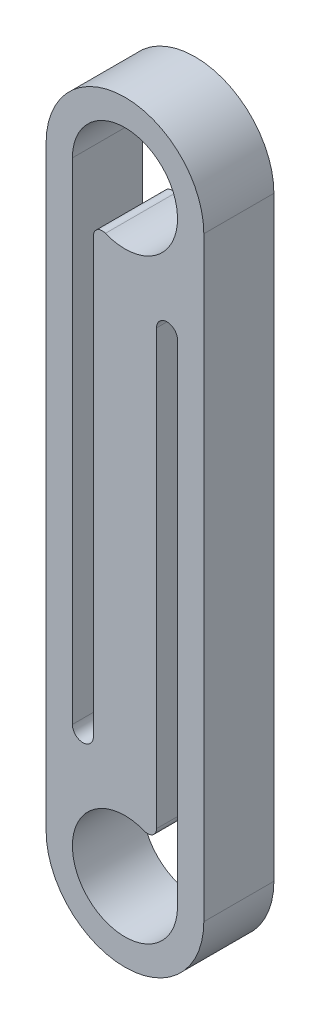
ISO-10303-21;
HEADER;
FILE_DESCRIPTION(('STEP AP214'),'2;1');
FILE_NAME('part.step','',(''),(''),'','','');
FILE_SCHEMA(('AUTOMOTIVE_DESIGN { 1 0 10303 214 1 1 1 1 }'));
ENDSEC;
DATA;
#1=APPLICATION_CONTEXT('core data for automotive mechanical design processes');
#2=APPLICATION_PROTOCOL_DEFINITION('international standard','automotive_design',2000,#1);
#3=PRODUCT_CONTEXT('',#1,'mechanical');
#4=PRODUCT('Part','Part','',(#3));
#5=PRODUCT_RELATED_PRODUCT_CATEGORY('part','',(#4));
#6=PRODUCT_DEFINITION_FORMATION('','',#4);
#7=PRODUCT_DEFINITION_CONTEXT('part definition',#1,'design');
#8=PRODUCT_DEFINITION('design','',#6,#7);
#9=PRODUCT_DEFINITION_SHAPE('','',#8);
#10=(LENGTH_UNIT() NAMED_UNIT(*) SI_UNIT(.MILLI.,.METRE.));
#11=(NAMED_UNIT(*) PLANE_ANGLE_UNIT() SI_UNIT($,.RADIAN.));
#12=(NAMED_UNIT(*) SI_UNIT($,.STERADIAN.) SOLID_ANGLE_UNIT());
#13=UNCERTAINTY_MEASURE_WITH_UNIT(LENGTH_MEASURE(1.E-05),#10,'distance_accuracy_value','');
#14=(GEOMETRIC_REPRESENTATION_CONTEXT(3) GLOBAL_UNCERTAINTY_ASSIGNED_CONTEXT((#13)) GLOBAL_UNIT_ASSIGNED_CONTEXT((#10,
#11,#12)) REPRESENTATION_CONTEXT('',''));
#15=CARTESIAN_POINT('',(0.,0.,0.));
#16=DIRECTION('',(0.,0.,1.));
#17=DIRECTION('',(1.,0.,0.));
#18=AXIS2_PLACEMENT_3D('',#15,#16,#17);
#19=CARTESIAN_POINT('',(0.,34.,4.));
#20=DIRECTION('',(0.,0.,1.));
#21=DIRECTION('',(1.,0.,0.));
#22=AXIS2_PLACEMENT_3D('',#19,#20,#21);
#23=PLANE('',#22);
#24=CARTESIAN_POINT('',(0.,34.,4.));
#25=DIRECTION('',(0.,0.,1.));
#26=DIRECTION('',(1.,0.,0.));
#27=AXIS2_PLACEMENT_3D('',#24,#25,#26);
#28=CIRCLE('',#27,4.5);
#29=CARTESIAN_POINT('',(4.49999999999999,34.,4.));
#30=VERTEX_POINT('',#29);
#31=CARTESIAN_POINT('',(-4.5,34.,4.));
#32=VERTEX_POINT('',#31);
#33=EDGE_CURVE('E218',#30,#32,#28,.T.);
#34=ORIENTED_EDGE('',*,*,#33,.T.);
#35=DIRECTION('',(0.,-1.,0.));
#36=VECTOR('',#35,1.);
#37=CARTESIAN_POINT('',(-4.5,34.,4.));
#38=LINE('',#37,#36);
#39=CARTESIAN_POINT('',(-4.5,0.,4.));
#40=VERTEX_POINT('',#39);
#41=EDGE_CURVE('E221',#32,#40,#38,.T.);
#42=ORIENTED_EDGE('',*,*,#41,.T.);
#43=CARTESIAN_POINT('',(0.,0.,4.));
#44=DIRECTION('',(0.,0.,1.));
#45=DIRECTION('',(1.,0.,0.));
#46=AXIS2_PLACEMENT_3D('',#43,#44,#45);
#47=CIRCLE('',#46,4.5);
#48=CARTESIAN_POINT('',(4.5,0.,4.));
#49=VERTEX_POINT('',#48);
#50=EDGE_CURVE('E224',#40,#49,#47,.T.);
#51=ORIENTED_EDGE('',*,*,#50,.T.);
#52=DIRECTION('',(0.,1.,0.));
#53=VECTOR('',#52,1.);
#54=CARTESIAN_POINT('',(4.49999999999999,34.,4.));
#55=LINE('',#54,#53);
#56=EDGE_CURVE('E226',#49,#30,#55,.T.);
#57=ORIENTED_EDGE('',*,*,#56,.T.);
#58=EDGE_LOOP('',(#34,#42,#51,#57));
#59=FACE_BOUND('',#58,.T.);
#60=DIRECTION('',(0.,-1.,0.));
#61=VECTOR('',#60,1.);
#62=CARTESIAN_POINT('',(-3.00000000000001,34.,4.));
#63=LINE('',#62,#61);
#64=CARTESIAN_POINT('',(-3.00000000000001,34.,4.));
#65=VERTEX_POINT('',#64);
#66=CARTESIAN_POINT('',(-3.00000000000001,6.,4.));
#67=VERTEX_POINT('',#66);
#68=EDGE_CURVE('E182',#65,#67,#63,.T.);
#69=ORIENTED_EDGE('',*,*,#68,.F.);
#70=CARTESIAN_POINT('',(0.,34.,4.));
#71=DIRECTION('',(0.,0.,1.));
#72=DIRECTION('',(1.,0.,0.));
#73=AXIS2_PLACEMENT_3D('',#70,#71,#72);
#74=CIRCLE('',#73,3.);
#75=CARTESIAN_POINT('',(-1.11428571428572,31.2146154041248,4.));
#76=VERTEX_POINT('',#75);
#77=EDGE_CURVE('E180',#76,#65,#74,.T.);
#78=ORIENTED_EDGE('',*,*,#77,.F.);
#79=CARTESIAN_POINT('',(-1.30000000000001,30.7503846381456,4.));
#80=DIRECTION('',(0.,0.,-1.));
#81=DIRECTION('',(-1.,0.,0.));
#82=AXIS2_PLACEMENT_3D('',#79,#80,#81);
#83=CIRCLE('',#82,0.500000000000001);
#84=CARTESIAN_POINT('',(-1.80000000000001,30.7503846381456,4.));
#85=VERTEX_POINT('',#84);
#86=EDGE_CURVE('E190',#85,#76,#83,.T.);
#87=ORIENTED_EDGE('',*,*,#86,.F.);
#88=DIRECTION('',(0.,1.,0.));
#89=VECTOR('',#88,1.);
#90=CARTESIAN_POINT('',(-1.80000000000001,6.,4.));
#91=LINE('',#90,#89);
#92=CARTESIAN_POINT('',(-1.80000000000001,6.,4.));
#93=VERTEX_POINT('',#92);
#94=EDGE_CURVE('E187',#93,#85,#91,.T.);
#95=ORIENTED_EDGE('',*,*,#94,.F.);
#96=CARTESIAN_POINT('',(-2.40000000000001,6.,4.));
#97=DIRECTION('',(0.,0.,1.));
#98=DIRECTION('',(1.,0.,0.));
#99=AXIS2_PLACEMENT_3D('',#96,#97,#98);
#100=CIRCLE('',#99,0.6);
#101=EDGE_CURVE('E185',#67,#93,#100,.T.);
#102=ORIENTED_EDGE('',*,*,#101,.F.);
#103=EDGE_LOOP('',(#69,#78,#87,#95,#102));
#104=FACE_BOUND('',#103,.T.);
#105=DIRECTION('',(0.,1.,0.));
#106=VECTOR('',#105,1.);
#107=CARTESIAN_POINT('',(3.,0.,4.));
#108=LINE('',#107,#106);
#109=CARTESIAN_POINT('',(3.,0.,4.));
#110=VERTEX_POINT('',#109);
#111=CARTESIAN_POINT('',(3.,28.,4.));
#112=VERTEX_POINT('',#111);
#113=EDGE_CURVE('E144',#110,#112,#108,.T.);
#114=ORIENTED_EDGE('',*,*,#113,.F.);
#115=CARTESIAN_POINT('',(0.,0.,4.));
#116=DIRECTION('',(0.,0.,1.));
#117=DIRECTION('',(1.,0.,0.));
#118=AXIS2_PLACEMENT_3D('',#115,#116,#117);
#119=CIRCLE('',#118,3.);
#120=CARTESIAN_POINT('',(1.11428571428571,2.78538459587519,4.));
#121=VERTEX_POINT('',#120);
#122=EDGE_CURVE('E136',#121,#110,#119,.T.);
#123=ORIENTED_EDGE('',*,*,#122,.F.);
#124=CARTESIAN_POINT('',(1.3,3.24961536185438,4.));
#125=DIRECTION('',(0.,0.,-1.));
#126=DIRECTION('',(-1.,0.,0.));
#127=AXIS2_PLACEMENT_3D('',#124,#125,#126);
#128=CIRCLE('',#127,0.5);
#129=CARTESIAN_POINT('',(1.8,3.24961536185438,4.));
#130=VERTEX_POINT('',#129);
#131=EDGE_CURVE('E163',#130,#121,#128,.T.);
#132=ORIENTED_EDGE('',*,*,#131,.F.);
#133=DIRECTION('',(0.,-1.,0.));
#134=VECTOR('',#133,1.);
#135=CARTESIAN_POINT('',(1.8,28.,4.));
#136=LINE('',#135,#134);
#137=CARTESIAN_POINT('',(1.8,28.,4.));
#138=VERTEX_POINT('',#137);
#139=EDGE_CURVE('E159',#138,#130,#136,.T.);
#140=ORIENTED_EDGE('',*,*,#139,.F.);
#141=CARTESIAN_POINT('',(2.4,28.,4.));
#142=DIRECTION('',(0.,0.,1.));
#143=DIRECTION('',(1.,0.,0.));
#144=AXIS2_PLACEMENT_3D('',#141,#142,#143);
#145=CIRCLE('',#144,0.6);
#146=EDGE_CURVE('E157',#112,#138,#145,.T.);
#147=ORIENTED_EDGE('',*,*,#146,.F.);
#148=EDGE_LOOP('',(#114,#123,#132,#140,#147));
#149=FACE_BOUND('',#148,.T.);
#150=ADVANCED_FACE('F35',(#59,#104,#149),#23,.T.);
#151=CARTESIAN_POINT('',(0.,34.,0.));
#152=DIRECTION('',(0.,0.,1.));
#153=DIRECTION('',(1.,0.,0.));
#154=AXIS2_PLACEMENT_3D('',#151,#152,#153);
#155=PLANE('',#154);
#156=CARTESIAN_POINT('',(0.,34.,0.));
#157=DIRECTION('',(0.,0.,1.));
#158=DIRECTION('',(1.,0.,0.));
#159=AXIS2_PLACEMENT_3D('',#156,#157,#158);
#160=CIRCLE('',#159,3.);
#161=CARTESIAN_POINT('',(-1.11428571428572,31.2146154041248,0.));
#162=VERTEX_POINT('',#161);
#163=CARTESIAN_POINT('',(-3.00000000000001,34.,0.));
#164=VERTEX_POINT('',#163);
#165=EDGE_CURVE('E152',#162,#164,#160,.T.);
#166=ORIENTED_EDGE('',*,*,#165,.T.);
#167=DIRECTION('',(0.,-1.,0.));
#168=VECTOR('',#167,1.);
#169=CARTESIAN_POINT('',(-3.00000000000001,34.,0.));
#170=LINE('',#169,#168);
#171=CARTESIAN_POINT('',(-3.00000000000001,6.,0.));
#172=VERTEX_POINT('',#171);
#173=EDGE_CURVE('E195',#164,#172,#170,.T.);
#174=ORIENTED_EDGE('',*,*,#173,.T.);
#175=CARTESIAN_POINT('',(-2.40000000000001,6.,0.));
#176=DIRECTION('',(0.,0.,1.));
#177=DIRECTION('',(1.,0.,0.));
#178=AXIS2_PLACEMENT_3D('',#175,#176,#177);
#179=CIRCLE('',#178,0.6);
#180=CARTESIAN_POINT('',(-1.80000000000001,6.,0.));
#181=VERTEX_POINT('',#180);
#182=EDGE_CURVE('E198',#172,#181,#179,.T.);
#183=ORIENTED_EDGE('',*,*,#182,.T.);
#184=DIRECTION('',(0.,1.,0.));
#185=VECTOR('',#184,1.);
#186=CARTESIAN_POINT('',(-1.80000000000001,6.,0.));
#187=LINE('',#186,#185);
#188=CARTESIAN_POINT('',(-1.80000000000001,30.7503846381456,0.));
#189=VERTEX_POINT('',#188);
#190=EDGE_CURVE('E201',#181,#189,#187,.T.);
#191=ORIENTED_EDGE('',*,*,#190,.T.);
#192=CARTESIAN_POINT('',(-1.30000000000001,30.7503846381456,0.));
#193=DIRECTION('',(0.,0.,-1.));
#194=DIRECTION('',(-1.,0.,0.));
#195=AXIS2_PLACEMENT_3D('',#192,#193,#194);
#196=CIRCLE('',#195,0.500000000000001);
#197=EDGE_CURVE('E183',#189,#162,#196,.T.);
#198=ORIENTED_EDGE('',*,*,#197,.T.);
#199=EDGE_LOOP('',(#166,#174,#183,#191,#198));
#200=FACE_BOUND('',#199,.T.);
#201=CARTESIAN_POINT('',(0.,34.,0.));
#202=DIRECTION('',(0.,0.,1.));
#203=DIRECTION('',(1.,0.,0.));
#204=AXIS2_PLACEMENT_3D('',#201,#202,#203);
#205=CIRCLE('',#204,4.5);
#206=CARTESIAN_POINT('',(4.49999999999999,34.,0.));
#207=VERTEX_POINT('',#206);
#208=CARTESIAN_POINT('',(-4.5,34.,0.));
#209=VERTEX_POINT('',#208);
#210=EDGE_CURVE('E217',#207,#209,#205,.T.);
#211=ORIENTED_EDGE('',*,*,#210,.F.);
#212=DIRECTION('',(0.,1.,0.));
#213=VECTOR('',#212,1.);
#214=CARTESIAN_POINT('',(4.49999999999999,34.,0.));
#215=LINE('',#214,#213);
#216=CARTESIAN_POINT('',(4.5,0.,0.));
#217=VERTEX_POINT('',#216);
#218=EDGE_CURVE('E222',#217,#207,#215,.T.);
#219=ORIENTED_EDGE('',*,*,#218,.F.);
#220=CARTESIAN_POINT('',(0.,0.,0.));
#221=DIRECTION('',(0.,0.,1.));
#222=DIRECTION('',(1.,0.,0.));
#223=AXIS2_PLACEMENT_3D('',#220,#221,#222);
#224=CIRCLE('',#223,4.5);
#225=CARTESIAN_POINT('',(-4.5,0.,0.));
#226=VERTEX_POINT('',#225);
#227=EDGE_CURVE('E233',#226,#217,#224,.T.);
#228=ORIENTED_EDGE('',*,*,#227,.F.);
#229=DIRECTION('',(0.,-1.,0.));
#230=VECTOR('',#229,1.);
#231=CARTESIAN_POINT('',(-4.5,34.,0.));
#232=LINE('',#231,#230);
#233=EDGE_CURVE('E231',#209,#226,#232,.T.);
#234=ORIENTED_EDGE('',*,*,#233,.F.);
#235=EDGE_LOOP('',(#211,#219,#228,#234));
#236=FACE_BOUND('',#235,.T.);
#237=CARTESIAN_POINT('',(0.,0.,0.));
#238=DIRECTION('',(0.,0.,1.));
#239=DIRECTION('',(1.,0.,0.));
#240=AXIS2_PLACEMENT_3D('',#237,#238,#239);
#241=CIRCLE('',#240,3.);
#242=CARTESIAN_POINT('',(1.11428571428571,2.78538459587519,0.));
#243=VERTEX_POINT('',#242);
#244=CARTESIAN_POINT('',(3.,0.,0.));
#245=VERTEX_POINT('',#244);
#246=EDGE_CURVE('E58',#243,#245,#241,.T.);
#247=ORIENTED_EDGE('',*,*,#246,.T.);
#248=DIRECTION('',(0.,1.,0.));
#249=VECTOR('',#248,1.);
#250=CARTESIAN_POINT('',(3.,0.,0.));
#251=LINE('',#250,#249);
#252=CARTESIAN_POINT('',(3.,28.,0.));
#253=VERTEX_POINT('',#252);
#254=EDGE_CURVE('E151',#245,#253,#251,.T.);
#255=ORIENTED_EDGE('',*,*,#254,.T.);
#256=CARTESIAN_POINT('',(2.4,28.,0.));
#257=DIRECTION('',(0.,0.,1.));
#258=DIRECTION('',(1.,0.,0.));
#259=AXIS2_PLACEMENT_3D('',#256,#257,#258);
#260=CIRCLE('',#259,0.6);
#261=CARTESIAN_POINT('',(1.8,28.,0.));
#262=VERTEX_POINT('',#261);
#263=EDGE_CURVE('E167',#253,#262,#260,.T.);
#264=ORIENTED_EDGE('',*,*,#263,.T.);
#265=DIRECTION('',(0.,-1.,0.));
#266=VECTOR('',#265,1.);
#267=CARTESIAN_POINT('',(1.8,28.,0.));
#268=LINE('',#267,#266);
#269=CARTESIAN_POINT('',(1.8,3.24961536185438,0.));
#270=VERTEX_POINT('',#269);
#271=EDGE_CURVE('E170',#262,#270,#268,.T.);
#272=ORIENTED_EDGE('',*,*,#271,.T.);
#273=CARTESIAN_POINT('',(1.3,3.24961536185438,0.));
#274=DIRECTION('',(0.,0.,-1.));
#275=DIRECTION('',(-1.,0.,0.));
#276=AXIS2_PLACEMENT_3D('',#273,#274,#275);
#277=CIRCLE('',#276,0.5);
#278=EDGE_CURVE('E145',#270,#243,#277,.T.);
#279=ORIENTED_EDGE('',*,*,#278,.T.);
#280=EDGE_LOOP('',(#247,#255,#264,#272,#279));
#281=FACE_BOUND('',#280,.T.);
#282=ADVANCED_FACE('F251',(#200,#236,#281),#155,.F.);
#283=CARTESIAN_POINT('',(0.,34.,4.));
#284=DIRECTION('',(0.,0.,-1.));
#285=DIRECTION('',(-1.,0.,0.));
#286=AXIS2_PLACEMENT_3D('',#283,#284,#285);
#287=CYLINDRICAL_SURFACE('',#286,4.5);
#288=ORIENTED_EDGE('',*,*,#210,.T.);
#289=DIRECTION('',(0.,0.,-1.));
#290=VECTOR('',#289,1.);
#291=CARTESIAN_POINT('',(-4.5,34.,4.));
#292=LINE('',#291,#290);
#293=EDGE_CURVE('E11',#32,#209,#292,.T.);
#294=ORIENTED_EDGE('',*,*,#293,.F.);
#295=ORIENTED_EDGE('',*,*,#33,.F.);
#296=DIRECTION('',(0.,0.,-1.));
#297=VECTOR('',#296,1.);
#298=CARTESIAN_POINT('',(4.49999999999999,34.,4.));
#299=LINE('',#298,#297);
#300=EDGE_CURVE('E228',#30,#207,#299,.T.);
#301=ORIENTED_EDGE('',*,*,#300,.T.);
#302=EDGE_LOOP('',(#288,#294,#295,#301));
#303=FACE_BOUND('',#302,.T.);
#304=ADVANCED_FACE('F37',(#303),#287,.T.);
#305=CARTESIAN_POINT('',(-4.5,34.,4.));
#306=DIRECTION('',(1.,0.,0.));
#307=DIRECTION('',(0.,1.,0.));
#308=AXIS2_PLACEMENT_3D('',#305,#306,#307);
#309=PLANE('',#308);
#310=ORIENTED_EDGE('',*,*,#233,.T.);
#311=DIRECTION('',(0.,0.,-1.));
#312=VECTOR('',#311,1.);
#313=CARTESIAN_POINT('',(-4.5,0.,4.));
#314=LINE('',#313,#312);
#315=EDGE_CURVE('E43',#40,#226,#314,.T.);
#316=ORIENTED_EDGE('',*,*,#315,.F.);
#317=ORIENTED_EDGE('',*,*,#41,.F.);
#318=ORIENTED_EDGE('',*,*,#293,.T.);
#319=EDGE_LOOP('',(#310,#316,#317,#318));
#320=FACE_BOUND('',#319,.T.);
#321=ADVANCED_FACE('F262',(#320),#309,.F.);
#322=CARTESIAN_POINT('',(0.,0.,4.));
#323=DIRECTION('',(0.,0.,-1.));
#324=DIRECTION('',(-1.,0.,0.));
#325=AXIS2_PLACEMENT_3D('',#322,#323,#324);
#326=CYLINDRICAL_SURFACE('',#325,4.5);
#327=ORIENTED_EDGE('',*,*,#227,.T.);
#328=DIRECTION('',(0.,0.,-1.));
#329=VECTOR('',#328,1.);
#330=CARTESIAN_POINT('',(4.5,0.,4.));
#331=LINE('',#330,#329);
#332=EDGE_CURVE('E238',#49,#217,#331,.T.);
#333=ORIENTED_EDGE('',*,*,#332,.F.);
#334=ORIENTED_EDGE('',*,*,#50,.F.);
#335=ORIENTED_EDGE('',*,*,#315,.T.);
#336=EDGE_LOOP('',(#327,#333,#334,#335));
#337=FACE_BOUND('',#336,.T.);
#338=ADVANCED_FACE('F245',(#337),#326,.T.);
#339=CARTESIAN_POINT('',(4.49999999999999,34.,4.));
#340=DIRECTION('',(-1.,0.,0.));
#341=DIRECTION('',(0.,-1.,0.));
#342=AXIS2_PLACEMENT_3D('',#339,#340,#341);
#343=PLANE('',#342);
#344=ORIENTED_EDGE('',*,*,#218,.T.);
#345=ORIENTED_EDGE('',*,*,#300,.F.);
#346=ORIENTED_EDGE('',*,*,#56,.F.);
#347=ORIENTED_EDGE('',*,*,#332,.T.);
#348=EDGE_LOOP('',(#344,#345,#346,#347));
#349=FACE_BOUND('',#348,.T.);
#350=ADVANCED_FACE('F255',(#349),#343,.F.);
#351=CARTESIAN_POINT('',(0.,34.,4.));
#352=DIRECTION('',(0.,0.,-1.));
#353=DIRECTION('',(-1.,0.,0.));
#354=AXIS2_PLACEMENT_3D('',#351,#352,#353);
#355=CYLINDRICAL_SURFACE('',#354,3.);
#356=ORIENTED_EDGE('',*,*,#165,.F.);
#357=DIRECTION('',(0.,0.,-1.));
#358=VECTOR('',#357,1.);
#359=CARTESIAN_POINT('',(-1.11428571428572,31.2146154041248,4.));
#360=LINE('',#359,#358);
#361=EDGE_CURVE('E192',#76,#162,#360,.T.);
#362=ORIENTED_EDGE('',*,*,#361,.F.);
#363=ORIENTED_EDGE('',*,*,#77,.T.);
#364=DIRECTION('',(0.,0.,-1.));
#365=VECTOR('',#364,1.);
#366=CARTESIAN_POINT('',(-3.00000000000001,34.,4.));
#367=LINE('',#366,#365);
#368=EDGE_CURVE('E214',#65,#164,#367,.T.);
#369=ORIENTED_EDGE('',*,*,#368,.T.);
#370=EDGE_LOOP('',(#356,#362,#363,#369));
#371=FACE_BOUND('',#370,.T.);
#372=ADVANCED_FACE('F277',(#371),#355,.F.);
#373=CARTESIAN_POINT('',(-3.00000000000001,34.,4.));
#374=DIRECTION('',(1.,0.,0.));
#375=DIRECTION('',(0.,0.,-1.));
#376=AXIS2_PLACEMENT_3D('',#373,#374,#375);
#377=PLANE('',#376);
#378=ORIENTED_EDGE('',*,*,#173,.F.);
#379=ORIENTED_EDGE('',*,*,#368,.F.);
#380=ORIENTED_EDGE('',*,*,#68,.T.);
#381=DIRECTION('',(0.,0.,-1.));
#382=VECTOR('',#381,1.);
#383=CARTESIAN_POINT('',(-3.00000000000001,6.,4.));
#384=LINE('',#383,#382);
#385=EDGE_CURVE('E212',#67,#172,#384,.T.);
#386=ORIENTED_EDGE('',*,*,#385,.T.);
#387=EDGE_LOOP('',(#378,#379,#380,#386));
#388=FACE_BOUND('',#387,.T.);
#389=ADVANCED_FACE('F284',(#388),#377,.T.);
#390=CARTESIAN_POINT('',(-2.40000000000001,6.,4.));
#391=DIRECTION('',(0.,0.,-1.));
#392=DIRECTION('',(-1.,0.,0.));
#393=AXIS2_PLACEMENT_3D('',#390,#391,#392);
#394=CYLINDRICAL_SURFACE('',#393,0.6);
#395=ORIENTED_EDGE('',*,*,#182,.F.);
#396=ORIENTED_EDGE('',*,*,#385,.F.);
#397=ORIENTED_EDGE('',*,*,#101,.T.);
#398=DIRECTION('',(0.,0.,-1.));
#399=VECTOR('',#398,1.);
#400=CARTESIAN_POINT('',(-1.80000000000001,6.,4.));
#401=LINE('',#400,#399);
#402=EDGE_CURVE('E210',#93,#181,#401,.T.);
#403=ORIENTED_EDGE('',*,*,#402,.T.);
#404=EDGE_LOOP('',(#395,#396,#397,#403));
#405=FACE_BOUND('',#404,.T.);
#406=ADVANCED_FACE('F289',(#405),#394,.F.);
#407=CARTESIAN_POINT('',(-1.80000000000001,6.,4.));
#408=DIRECTION('',(-1.,0.,0.));
#409=DIRECTION('',(0.,0.,1.));
#410=AXIS2_PLACEMENT_3D('',#407,#408,#409);
#411=PLANE('',#410);
#412=ORIENTED_EDGE('',*,*,#190,.F.);
#413=ORIENTED_EDGE('',*,*,#402,.F.);
#414=ORIENTED_EDGE('',*,*,#94,.T.);
#415=DIRECTION('',(0.,0.,-1.));
#416=VECTOR('',#415,1.);
#417=CARTESIAN_POINT('',(-1.80000000000001,30.7503846381456,4.));
#418=LINE('',#417,#416);
#419=EDGE_CURVE('E208',#85,#189,#418,.T.);
#420=ORIENTED_EDGE('',*,*,#419,.T.);
#421=EDGE_LOOP('',(#412,#413,#414,#420));
#422=FACE_BOUND('',#421,.T.);
#423=ADVANCED_FACE('F302',(#422),#411,.T.);
#424=CARTESIAN_POINT('',(-1.30000000000001,30.7503846381456,4.));
#425=DIRECTION('',(0.,0.,-1.));
#426=DIRECTION('',(-1.,0.,0.));
#427=AXIS2_PLACEMENT_3D('',#424,#425,#426);
#428=CYLINDRICAL_SURFACE('',#427,0.500000000000001);
#429=ORIENTED_EDGE('',*,*,#197,.F.);
#430=ORIENTED_EDGE('',*,*,#419,.F.);
#431=ORIENTED_EDGE('',*,*,#86,.T.);
#432=ORIENTED_EDGE('',*,*,#361,.T.);
#433=EDGE_LOOP('',(#429,#430,#431,#432));
#434=FACE_BOUND('',#433,.T.);
#435=ADVANCED_FACE('F296',(#434),#428,.T.);
#436=CARTESIAN_POINT('',(0.,0.,4.));
#437=DIRECTION('',(0.,0.,-1.));
#438=DIRECTION('',(-1.,0.,0.));
#439=AXIS2_PLACEMENT_3D('',#436,#437,#438);
#440=CYLINDRICAL_SURFACE('',#439,3.);
#441=ORIENTED_EDGE('',*,*,#246,.F.);
#442=DIRECTION('',(0.,0.,-1.));
#443=VECTOR('',#442,1.);
#444=CARTESIAN_POINT('',(1.11428571428571,2.78538459587519,4.));
#445=LINE('',#444,#443);
#446=EDGE_CURVE('E140',#121,#243,#445,.T.);
#447=ORIENTED_EDGE('',*,*,#446,.F.);
#448=ORIENTED_EDGE('',*,*,#122,.T.);
#449=DIRECTION('',(0.,0.,-1.));
#450=VECTOR('',#449,1.);
#451=CARTESIAN_POINT('',(3.,0.,4.));
#452=LINE('',#451,#450);
#453=EDGE_CURVE('E139',#110,#245,#452,.T.);
#454=ORIENTED_EDGE('',*,*,#453,.T.);
#455=EDGE_LOOP('',(#441,#447,#448,#454));
#456=FACE_BOUND('',#455,.T.);
#457=ADVANCED_FACE('F138',(#456),#440,.F.);
#458=CARTESIAN_POINT('',(3.,0.,4.));
#459=DIRECTION('',(-1.,0.,0.));
#460=DIRECTION('',(0.,-1.,0.));
#461=AXIS2_PLACEMENT_3D('',#458,#459,#460);
#462=PLANE('',#461);
#463=ORIENTED_EDGE('',*,*,#254,.F.);
#464=ORIENTED_EDGE('',*,*,#453,.F.);
#465=ORIENTED_EDGE('',*,*,#113,.T.);
#466=DIRECTION('',(0.,0.,-1.));
#467=VECTOR('',#466,1.);
#468=CARTESIAN_POINT('',(3.,28.,4.));
#469=LINE('',#468,#467);
#470=EDGE_CURVE('E153',#112,#253,#469,.T.);
#471=ORIENTED_EDGE('',*,*,#470,.T.);
#472=EDGE_LOOP('',(#463,#464,#465,#471));
#473=FACE_BOUND('',#472,.T.);
#474=ADVANCED_FACE('F148',(#473),#462,.T.);
#475=CARTESIAN_POINT('',(2.4,28.,4.));
#476=DIRECTION('',(0.,0.,-1.));
#477=DIRECTION('',(-1.,0.,0.));
#478=AXIS2_PLACEMENT_3D('',#475,#476,#477);
#479=CYLINDRICAL_SURFACE('',#478,0.6);
#480=ORIENTED_EDGE('',*,*,#263,.F.);
#481=ORIENTED_EDGE('',*,*,#470,.F.);
#482=ORIENTED_EDGE('',*,*,#146,.T.);
#483=DIRECTION('',(0.,0.,-1.));
#484=VECTOR('',#483,1.);
#485=CARTESIAN_POINT('',(1.8,28.,4.));
#486=LINE('',#485,#484);
#487=EDGE_CURVE('E177',#138,#262,#486,.T.);
#488=ORIENTED_EDGE('',*,*,#487,.T.);
#489=EDGE_LOOP('',(#480,#481,#482,#488));
#490=FACE_BOUND('',#489,.T.);
#491=ADVANCED_FACE('F321',(#490),#479,.F.);
#492=CARTESIAN_POINT('',(1.8,28.,4.));
#493=DIRECTION('',(1.,0.,0.));
#494=DIRECTION('',(0.,0.,-1.));
#495=AXIS2_PLACEMENT_3D('',#492,#493,#494);
#496=PLANE('',#495);
#497=ORIENTED_EDGE('',*,*,#271,.F.);
#498=ORIENTED_EDGE('',*,*,#487,.F.);
#499=ORIENTED_EDGE('',*,*,#139,.T.);
#500=DIRECTION('',(0.,0.,-1.));
#501=VECTOR('',#500,1.);
#502=CARTESIAN_POINT('',(1.8,3.24961536185438,4.));
#503=LINE('',#502,#501);
#504=EDGE_CURVE('E50',#130,#270,#503,.T.);
#505=ORIENTED_EDGE('',*,*,#504,.T.);
#506=EDGE_LOOP('',(#497,#498,#499,#505));
#507=FACE_BOUND('',#506,.T.);
#508=ADVANCED_FACE('F324',(#507),#496,.T.);
#509=CARTESIAN_POINT('',(1.3,3.24961536185438,4.));
#510=DIRECTION('',(0.,0.,-1.));
#511=DIRECTION('',(-1.,0.,0.));
#512=AXIS2_PLACEMENT_3D('',#509,#510,#511);
#513=CYLINDRICAL_SURFACE('',#512,0.5);
#514=ORIENTED_EDGE('',*,*,#278,.F.);
#515=ORIENTED_EDGE('',*,*,#504,.F.);
#516=ORIENTED_EDGE('',*,*,#131,.T.);
#517=ORIENTED_EDGE('',*,*,#446,.T.);
#518=EDGE_LOOP('',(#514,#515,#516,#517));
#519=FACE_BOUND('',#518,.T.);
#520=ADVANCED_FACE('F328',(#519),#513,.T.);
#521=CLOSED_SHELL('',(#150,#282,#304,#321,#338,#350,#372,#389,#406,#423,#435,#457,#474,#491,
#508,#520));
#522=MANIFOLD_SOLID_BREP('B2',#521);
#523=ADVANCED_BREP_SHAPE_REPRESENTATION('',(#18,#522),#14);
#524=SHAPE_DEFINITION_REPRESENTATION(#9,#523);
ENDSEC;
END-ISO-10303-21;
